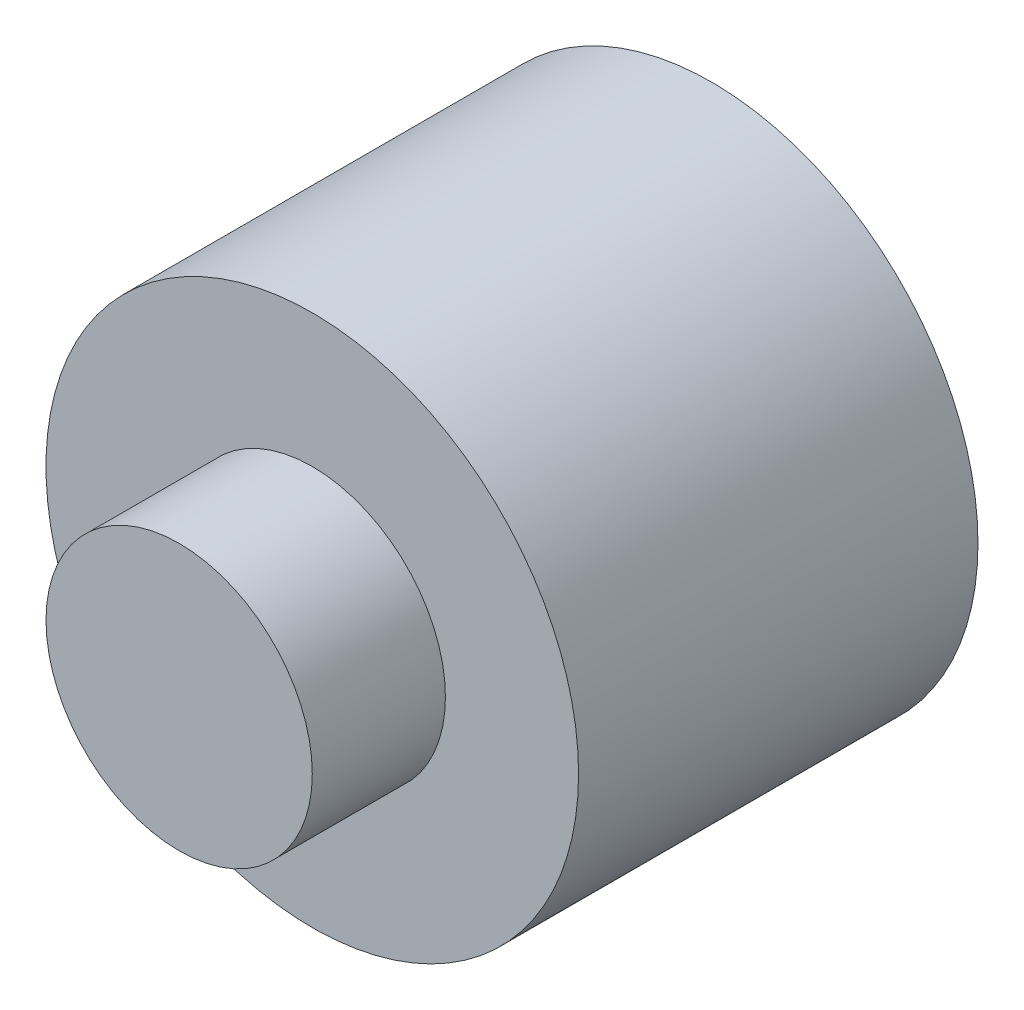
ISO-10303-21;
HEADER;
FILE_DESCRIPTION(('STEP AP214'),'2;1');
FILE_NAME('part.step','',(''),(''),'','','');
FILE_SCHEMA(('AUTOMOTIVE_DESIGN { 1 0 10303 214 1 1 1 1 }'));
ENDSEC;
DATA;
#1=APPLICATION_CONTEXT('core data for automotive mechanical design processes');
#2=APPLICATION_PROTOCOL_DEFINITION('international standard','automotive_design',2000,#1);
#3=PRODUCT_CONTEXT('',#1,'mechanical');
#4=PRODUCT('Part','Part','',(#3));
#5=PRODUCT_RELATED_PRODUCT_CATEGORY('part','',(#4));
#6=PRODUCT_DEFINITION_FORMATION('','',#4);
#7=PRODUCT_DEFINITION_CONTEXT('part definition',#1,'design');
#8=PRODUCT_DEFINITION('design','',#6,#7);
#9=PRODUCT_DEFINITION_SHAPE('','',#8);
#10=(LENGTH_UNIT() NAMED_UNIT(*) SI_UNIT(.MILLI.,.METRE.));
#11=(NAMED_UNIT(*) PLANE_ANGLE_UNIT() SI_UNIT($,.RADIAN.));
#12=(NAMED_UNIT(*) SI_UNIT($,.STERADIAN.) SOLID_ANGLE_UNIT());
#13=UNCERTAINTY_MEASURE_WITH_UNIT(LENGTH_MEASURE(1.E-05),#10,'distance_accuracy_value','');
#14=(GEOMETRIC_REPRESENTATION_CONTEXT(3) GLOBAL_UNCERTAINTY_ASSIGNED_CONTEXT((#13)) GLOBAL_UNIT_ASSIGNED_CONTEXT((#10,
#11,#12)) REPRESENTATION_CONTEXT('',''));
#15=CARTESIAN_POINT('',(0.,0.,0.));
#16=DIRECTION('',(0.,0.,1.));
#17=DIRECTION('',(1.,0.,0.));
#18=AXIS2_PLACEMENT_3D('',#15,#16,#17);
#19=CARTESIAN_POINT('',(0.,0.,50.8));
#20=DIRECTION('',(0.,0.,-1.));
#21=DIRECTION('',(-1.,0.,0.));
#22=AXIS2_PLACEMENT_3D('',#19,#20,#21);
#23=CYLINDRICAL_SURFACE('',#22,12.7);
#24=CARTESIAN_POINT('',(0.,0.,38.1));
#25=DIRECTION('',(0.,0.,1.));
#26=DIRECTION('',(1.,0.,0.));
#27=AXIS2_PLACEMENT_3D('',#24,#25,#26);
#28=CIRCLE('',#27,12.7);
#29=CARTESIAN_POINT('',(12.7,0.,38.1));
#30=VERTEX_POINT('',#29);
#31=EDGE_CURVE('E18',#30,#30,#28,.T.);
#32=ORIENTED_EDGE('',*,*,#31,.T.);
#33=EDGE_LOOP('',(#32));
#34=FACE_BOUND('',#33,.T.);
#35=CARTESIAN_POINT('',(0.,0.,50.8));
#36=DIRECTION('',(0.,0.,1.));
#37=DIRECTION('',(1.,0.,0.));
#38=AXIS2_PLACEMENT_3D('',#35,#36,#37);
#39=CIRCLE('',#38,12.7);
#40=CARTESIAN_POINT('',(12.7,0.,50.8));
#41=VERTEX_POINT('',#40);
#42=EDGE_CURVE('E10',#41,#41,#39,.T.);
#43=ORIENTED_EDGE('',*,*,#42,.F.);
#44=EDGE_LOOP('',(#43));
#45=FACE_BOUND('',#44,.T.);
#46=ADVANCED_FACE('F15',(#34,#45),#23,.T.);
#47=CARTESIAN_POINT('',(0.,0.,50.8));
#48=DIRECTION('',(0.,0.,1.));
#49=DIRECTION('',(1.,0.,0.));
#50=AXIS2_PLACEMENT_3D('',#47,#48,#49);
#51=PLANE('',#50);
#52=ORIENTED_EDGE('',*,*,#42,.T.);
#53=EDGE_LOOP('',(#52));
#54=FACE_BOUND('',#53,.T.);
#55=ADVANCED_FACE('F55',(#54),#51,.T.);
#56=CARTESIAN_POINT('',(0.,0.,38.1));
#57=DIRECTION('',(0.,0.,-1.));
#58=DIRECTION('',(-1.,0.,0.));
#59=AXIS2_PLACEMENT_3D('',#56,#57,#58);
#60=CYLINDRICAL_SURFACE('',#59,25.4);
#61=CARTESIAN_POINT('',(0.,0.,38.1));
#62=DIRECTION('',(0.,0.,1.));
#63=DIRECTION('',(1.,0.,0.));
#64=AXIS2_PLACEMENT_3D('',#61,#62,#63);
#65=CIRCLE('',#64,25.4);
#66=CARTESIAN_POINT('',(25.4,0.,38.1));
#67=VERTEX_POINT('',#66);
#68=EDGE_CURVE('E25',#67,#67,#65,.T.);
#69=ORIENTED_EDGE('',*,*,#68,.F.);
#70=EDGE_LOOP('',(#69));
#71=FACE_BOUND('',#70,.T.);
#72=CARTESIAN_POINT('',(0.,0.,0.));
#73=DIRECTION('',(0.,0.,1.));
#74=DIRECTION('',(1.,0.,0.));
#75=AXIS2_PLACEMENT_3D('',#72,#73,#74);
#76=CIRCLE('',#75,25.4);
#77=CARTESIAN_POINT('',(25.4,0.,0.));
#78=VERTEX_POINT('',#77);
#79=EDGE_CURVE('E27',#78,#78,#76,.T.);
#80=ORIENTED_EDGE('',*,*,#79,.T.);
#81=EDGE_LOOP('',(#80));
#82=FACE_BOUND('',#81,.T.);
#83=ADVANCED_FACE('F53',(#71,#82),#60,.T.);
#84=CARTESIAN_POINT('',(0.,0.,38.1));
#85=DIRECTION('',(0.,0.,1.));
#86=DIRECTION('',(1.,0.,0.));
#87=AXIS2_PLACEMENT_3D('',#84,#85,#86);
#88=PLANE('',#87);
#89=ORIENTED_EDGE('',*,*,#31,.F.);
#90=EDGE_LOOP('',(#89));
#91=FACE_BOUND('',#90,.T.);
#92=ORIENTED_EDGE('',*,*,#68,.T.);
#93=EDGE_LOOP('',(#92));
#94=FACE_BOUND('',#93,.T.);
#95=ADVANCED_FACE('F50',(#91,#94),#88,.T.);
#96=CARTESIAN_POINT('',(0.,0.,0.));
#97=DIRECTION('',(0.,0.,1.));
#98=DIRECTION('',(1.,0.,0.));
#99=AXIS2_PLACEMENT_3D('',#96,#97,#98);
#100=PLANE('',#99);
#101=CARTESIAN_POINT('',(0.,0.,0.));
#102=DIRECTION('',(0.,0.,-1.));
#103=DIRECTION('',(-1.,0.,0.));
#104=AXIS2_PLACEMENT_3D('',#101,#102,#103);
#105=CIRCLE('',#104,22.225);
#106=CARTESIAN_POINT('',(-22.225,0.,0.));
#107=VERTEX_POINT('',#106);
#108=EDGE_CURVE('E33',#107,#107,#105,.T.);
#109=ORIENTED_EDGE('',*,*,#108,.F.);
#110=EDGE_LOOP('',(#109));
#111=FACE_BOUND('',#110,.T.);
#112=ORIENTED_EDGE('',*,*,#79,.F.);
#113=EDGE_LOOP('',(#112));
#114=FACE_BOUND('',#113,.T.);
#115=ADVANCED_FACE('F44',(#111,#114),#100,.F.);
#116=CARTESIAN_POINT('',(0.,0.,35.56));
#117=DIRECTION('',(0.,0.,-1.));
#118=DIRECTION('',(-1.,0.,0.));
#119=AXIS2_PLACEMENT_3D('',#116,#117,#118);
#120=CYLINDRICAL_SURFACE('',#119,22.225);
#121=CARTESIAN_POINT('',(0.,0.,35.56));
#122=DIRECTION('',(0.,0.,-1.));
#123=DIRECTION('',(-1.,0.,0.));
#124=AXIS2_PLACEMENT_3D('',#121,#122,#123);
#125=CIRCLE('',#124,22.225);
#126=CARTESIAN_POINT('',(-22.225,0.,35.56));
#127=VERTEX_POINT('',#126);
#128=EDGE_CURVE('E30',#127,#127,#125,.T.);
#129=ORIENTED_EDGE('',*,*,#128,.F.);
#130=EDGE_LOOP('',(#129));
#131=FACE_BOUND('',#130,.T.);
#132=ORIENTED_EDGE('',*,*,#108,.T.);
#133=EDGE_LOOP('',(#132));
#134=FACE_BOUND('',#133,.T.);
#135=ADVANCED_FACE('F41',(#131,#134),#120,.F.);
#136=CARTESIAN_POINT('',(0.,0.,35.56));
#137=DIRECTION('',(0.,0.,-1.));
#138=DIRECTION('',(1.,0.,0.));
#139=AXIS2_PLACEMENT_3D('',#136,#137,#138);
#140=PLANE('',#139);
#141=ORIENTED_EDGE('',*,*,#128,.T.);
#142=EDGE_LOOP('',(#141));
#143=FACE_BOUND('',#142,.T.);
#144=ADVANCED_FACE('F39',(#143),#140,.T.);
#145=CLOSED_SHELL('',(#46,#55,#83,#95,#115,#135,#144));
#146=MANIFOLD_SOLID_BREP('B1',#145);
#147=ADVANCED_BREP_SHAPE_REPRESENTATION('',(#18,#146),#14);
#148=SHAPE_DEFINITION_REPRESENTATION(#9,#147);
ENDSEC;
END-ISO-10303-21;
